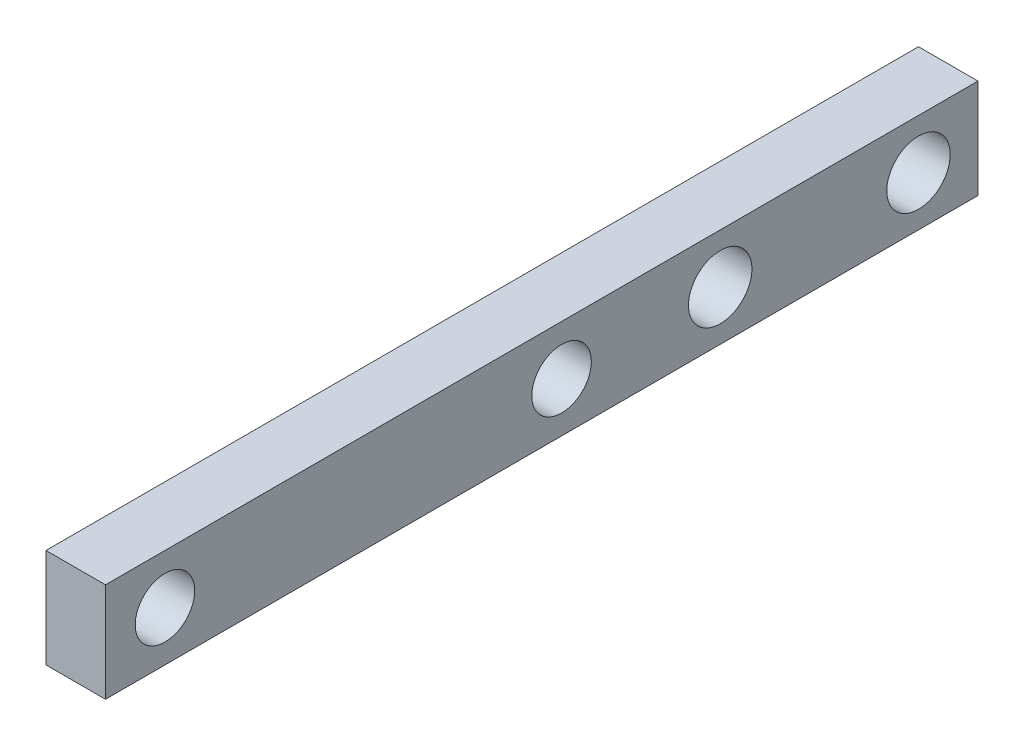
ISO-10303-21;
HEADER;
FILE_DESCRIPTION(('STEP AP214'),'2;1');
FILE_NAME('part.step','',(''),(''),'','','');
FILE_SCHEMA(('AUTOMOTIVE_DESIGN { 1 0 10303 214 1 1 1 1 }'));
ENDSEC;
DATA;
#1=APPLICATION_CONTEXT('core data for automotive mechanical design processes');
#2=APPLICATION_PROTOCOL_DEFINITION('international standard','automotive_design',2000,#1);
#3=PRODUCT_CONTEXT('',#1,'mechanical');
#4=PRODUCT('Part','Part','',(#3));
#5=PRODUCT_RELATED_PRODUCT_CATEGORY('part','',(#4));
#6=PRODUCT_DEFINITION_FORMATION('','',#4);
#7=PRODUCT_DEFINITION_CONTEXT('part definition',#1,'design');
#8=PRODUCT_DEFINITION('design','',#6,#7);
#9=PRODUCT_DEFINITION_SHAPE('','',#8);
#10=(LENGTH_UNIT() NAMED_UNIT(*) SI_UNIT(.MILLI.,.METRE.));
#11=(NAMED_UNIT(*) PLANE_ANGLE_UNIT() SI_UNIT($,.RADIAN.));
#12=(NAMED_UNIT(*) SI_UNIT($,.STERADIAN.) SOLID_ANGLE_UNIT());
#13=UNCERTAINTY_MEASURE_WITH_UNIT(LENGTH_MEASURE(1.E-05),#10,'distance_accuracy_value','');
#14=(GEOMETRIC_REPRESENTATION_CONTEXT(3) GLOBAL_UNCERTAINTY_ASSIGNED_CONTEXT((#13)) GLOBAL_UNIT_ASSIGNED_CONTEXT((#10,
#11,#12)) REPRESENTATION_CONTEXT('',''));
#15=CARTESIAN_POINT('',(0.,0.,0.));
#16=DIRECTION('',(0.,0.,1.));
#17=DIRECTION('',(1.,0.,0.));
#18=AXIS2_PLACEMENT_3D('',#15,#16,#17);
#19=CARTESIAN_POINT('',(3.,0.,0.));
#20=DIRECTION('',(-1.,0.,0.));
#21=DIRECTION('',(0.,0.,1.));
#22=AXIS2_PLACEMENT_3D('',#19,#20,#21);
#23=PLANE('',#22);
#24=DIRECTION('',(0.,1.,0.));
#25=VECTOR('',#24,1.);
#26=CARTESIAN_POINT('',(3.,-2.49999999999999,-22.));
#27=LINE('',#26,#25);
#28=CARTESIAN_POINT('',(3.,-2.49999999999999,-22.));
#29=VERTEX_POINT('',#28);
#30=CARTESIAN_POINT('',(3.,2.49999999999999,-22.));
#31=VERTEX_POINT('',#30);
#32=EDGE_CURVE('E87',#29,#31,#27,.T.);
#33=ORIENTED_EDGE('',*,*,#32,.T.);
#34=DIRECTION('',(0.,0.,1.));
#35=VECTOR('',#34,1.);
#36=CARTESIAN_POINT('',(3.,2.49999999999999,22.));
#37=LINE('',#36,#35);
#38=CARTESIAN_POINT('',(3.,2.49999999999999,22.));
#39=VERTEX_POINT('',#38);
#40=EDGE_CURVE('E82',#31,#39,#37,.T.);
#41=ORIENTED_EDGE('',*,*,#40,.T.);
#42=DIRECTION('',(0.,-1.,0.));
#43=VECTOR('',#42,1.);
#44=CARTESIAN_POINT('',(3.,-2.5,22.));
#45=LINE('',#44,#43);
#46=CARTESIAN_POINT('',(3.,-2.5,22.));
#47=VERTEX_POINT('',#46);
#48=EDGE_CURVE('E85',#39,#47,#45,.T.);
#49=ORIENTED_EDGE('',*,*,#48,.T.);
#50=DIRECTION('',(0.,0.,-1.));
#51=VECTOR('',#50,1.);
#52=CARTESIAN_POINT('',(3.,-2.5,22.));
#53=LINE('',#52,#51);
#54=EDGE_CURVE('E52',#47,#29,#53,.T.);
#55=ORIENTED_EDGE('',*,*,#54,.T.);
#56=EDGE_LOOP('',(#33,#41,#49,#55));
#57=FACE_BOUND('',#56,.T.);
#58=CARTESIAN_POINT('',(3.,0.,-19.));
#59=DIRECTION('',(1.,0.,0.));
#60=DIRECTION('',(0.,0.,-1.));
#61=AXIS2_PLACEMENT_3D('',#58,#59,#60);
#62=CIRCLE('',#61,1.6);
#63=CARTESIAN_POINT('',(3.,0.,-20.6));
#64=VERTEX_POINT('',#63);
#65=EDGE_CURVE('E102',#64,#64,#62,.T.);
#66=ORIENTED_EDGE('',*,*,#65,.F.);
#67=EDGE_LOOP('',(#66));
#68=FACE_BOUND('',#67,.T.);
#69=CARTESIAN_POINT('',(3.,0.,-9.));
#70=DIRECTION('',(1.,0.,0.));
#71=DIRECTION('',(0.,0.,-1.));
#72=AXIS2_PLACEMENT_3D('',#69,#70,#71);
#73=CIRCLE('',#72,1.6);
#74=CARTESIAN_POINT('',(3.,0.,-10.6));
#75=VERTEX_POINT('',#74);
#76=EDGE_CURVE('E117',#75,#75,#73,.T.);
#77=ORIENTED_EDGE('',*,*,#76,.F.);
#78=EDGE_LOOP('',(#77));
#79=FACE_BOUND('',#78,.T.);
#80=CARTESIAN_POINT('',(3.,0.,-0.999999999999999));
#81=DIRECTION('',(1.,0.,0.));
#82=DIRECTION('',(0.,0.,-1.));
#83=AXIS2_PLACEMENT_3D('',#80,#81,#82);
#84=CIRCLE('',#83,1.5);
#85=CARTESIAN_POINT('',(3.,0.,-2.5));
#86=VERTEX_POINT('',#85);
#87=EDGE_CURVE('E123',#86,#86,#84,.T.);
#88=ORIENTED_EDGE('',*,*,#87,.F.);
#89=EDGE_LOOP('',(#88));
#90=FACE_BOUND('',#89,.T.);
#91=CARTESIAN_POINT('',(3.,0.,19.));
#92=DIRECTION('',(1.,0.,0.));
#93=DIRECTION('',(0.,0.,-1.));
#94=AXIS2_PLACEMENT_3D('',#91,#92,#93);
#95=CIRCLE('',#94,1.5);
#96=CARTESIAN_POINT('',(3.,0.,17.5));
#97=VERTEX_POINT('',#96);
#98=EDGE_CURVE('E129',#97,#97,#95,.T.);
#99=ORIENTED_EDGE('',*,*,#98,.F.);
#100=EDGE_LOOP('',(#99));
#101=FACE_BOUND('',#100,.T.);
#102=ADVANCED_FACE('F35',(#57,#68,#79,#90,#101),#23,.F.);
#103=CARTESIAN_POINT('',(0.,0.,0.));
#104=DIRECTION('',(-1.,0.,0.));
#105=DIRECTION('',(0.,0.,1.));
#106=AXIS2_PLACEMENT_3D('',#103,#104,#105);
#107=PLANE('',#106);
#108=CARTESIAN_POINT('',(0.,0.,-0.999999999999999));
#109=DIRECTION('',(1.,0.,0.));
#110=DIRECTION('',(0.,0.,-1.));
#111=AXIS2_PLACEMENT_3D('',#108,#109,#110);
#112=CIRCLE('',#111,1.5);
#113=CARTESIAN_POINT('',(0.,0.,-2.5));
#114=VERTEX_POINT('',#113);
#115=EDGE_CURVE('E126',#114,#114,#112,.T.);
#116=ORIENTED_EDGE('',*,*,#115,.T.);
#117=EDGE_LOOP('',(#116));
#118=FACE_BOUND('',#117,.T.);
#119=CARTESIAN_POINT('',(0.,0.,-19.));
#120=DIRECTION('',(1.,0.,0.));
#121=DIRECTION('',(0.,0.,-1.));
#122=AXIS2_PLACEMENT_3D('',#119,#120,#121);
#123=CIRCLE('',#122,1.6);
#124=CARTESIAN_POINT('',(0.,0.,-20.6));
#125=VERTEX_POINT('',#124);
#126=EDGE_CURVE('E114',#125,#125,#123,.T.);
#127=ORIENTED_EDGE('',*,*,#126,.T.);
#128=EDGE_LOOP('',(#127));
#129=FACE_BOUND('',#128,.T.);
#130=DIRECTION('',(0.,1.,0.));
#131=VECTOR('',#130,1.);
#132=CARTESIAN_POINT('',(0.,-2.49999999999999,-22.));
#133=LINE('',#132,#131);
#134=CARTESIAN_POINT('',(0.,-2.49999999999999,-22.));
#135=VERTEX_POINT('',#134);
#136=CARTESIAN_POINT('',(0.,2.49999999999999,-22.));
#137=VERTEX_POINT('',#136);
#138=EDGE_CURVE('E99',#135,#137,#133,.T.);
#139=ORIENTED_EDGE('',*,*,#138,.F.);
#140=DIRECTION('',(0.,0.,-1.));
#141=VECTOR('',#140,1.);
#142=CARTESIAN_POINT('',(0.,-2.5,22.));
#143=LINE('',#142,#141);
#144=CARTESIAN_POINT('',(0.,-2.5,22.));
#145=VERTEX_POINT('',#144);
#146=EDGE_CURVE('E75',#145,#135,#143,.T.);
#147=ORIENTED_EDGE('',*,*,#146,.F.);
#148=DIRECTION('',(0.,-1.,0.));
#149=VECTOR('',#148,1.);
#150=CARTESIAN_POINT('',(0.,-2.5,22.));
#151=LINE('',#150,#149);
#152=CARTESIAN_POINT('',(0.,2.49999999999999,22.));
#153=VERTEX_POINT('',#152);
#154=EDGE_CURVE('E69',#153,#145,#151,.T.);
#155=ORIENTED_EDGE('',*,*,#154,.F.);
#156=DIRECTION('',(0.,0.,1.));
#157=VECTOR('',#156,1.);
#158=CARTESIAN_POINT('',(0.,2.49999999999999,22.));
#159=LINE('',#158,#157);
#160=EDGE_CURVE('E91',#137,#153,#159,.T.);
#161=ORIENTED_EDGE('',*,*,#160,.F.);
#162=EDGE_LOOP('',(#139,#147,#155,#161));
#163=FACE_BOUND('',#162,.T.);
#164=CARTESIAN_POINT('',(0.,0.,-9.));
#165=DIRECTION('',(1.,0.,0.));
#166=DIRECTION('',(0.,0.,-1.));
#167=AXIS2_PLACEMENT_3D('',#164,#165,#166);
#168=CIRCLE('',#167,1.6);
#169=CARTESIAN_POINT('',(0.,0.,-10.6));
#170=VERTEX_POINT('',#169);
#171=EDGE_CURVE('E120',#170,#170,#168,.T.);
#172=ORIENTED_EDGE('',*,*,#171,.T.);
#173=EDGE_LOOP('',(#172));
#174=FACE_BOUND('',#173,.T.);
#175=CARTESIAN_POINT('',(0.,0.,19.));
#176=DIRECTION('',(1.,0.,0.));
#177=DIRECTION('',(0.,0.,-1.));
#178=AXIS2_PLACEMENT_3D('',#175,#176,#177);
#179=CIRCLE('',#178,1.5);
#180=CARTESIAN_POINT('',(0.,0.,17.5));
#181=VERTEX_POINT('',#180);
#182=EDGE_CURVE('E132',#181,#181,#179,.T.);
#183=ORIENTED_EDGE('',*,*,#182,.T.);
#184=EDGE_LOOP('',(#183));
#185=FACE_BOUND('',#184,.T.);
#186=ADVANCED_FACE('F110',(#118,#129,#163,#174,#185),#107,.T.);
#187=CARTESIAN_POINT('',(3.,-2.49999999999999,-22.));
#188=DIRECTION('',(0.,0.,1.));
#189=DIRECTION('',(1.,0.,0.));
#190=AXIS2_PLACEMENT_3D('',#187,#188,#189);
#191=PLANE('',#190);
#192=ORIENTED_EDGE('',*,*,#138,.T.);
#193=DIRECTION('',(-1.,0.,0.));
#194=VECTOR('',#193,1.);
#195=CARTESIAN_POINT('',(3.,2.49999999999999,-22.));
#196=LINE('',#195,#194);
#197=EDGE_CURVE('E11',#31,#137,#196,.T.);
#198=ORIENTED_EDGE('',*,*,#197,.F.);
#199=ORIENTED_EDGE('',*,*,#32,.F.);
#200=DIRECTION('',(-1.,0.,0.));
#201=VECTOR('',#200,1.);
#202=CARTESIAN_POINT('',(3.,-2.49999999999999,-22.));
#203=LINE('',#202,#201);
#204=EDGE_CURVE('E95',#29,#135,#203,.T.);
#205=ORIENTED_EDGE('',*,*,#204,.T.);
#206=EDGE_LOOP('',(#192,#198,#199,#205));
#207=FACE_BOUND('',#206,.T.);
#208=ADVANCED_FACE('F37',(#207),#191,.F.);
#209=CARTESIAN_POINT('',(3.,2.49999999999999,22.));
#210=DIRECTION('',(0.,-1.,0.));
#211=DIRECTION('',(0.,0.,-1.));
#212=AXIS2_PLACEMENT_3D('',#209,#210,#211);
#213=PLANE('',#212);
#214=ORIENTED_EDGE('',*,*,#160,.T.);
#215=DIRECTION('',(-1.,0.,0.));
#216=VECTOR('',#215,1.);
#217=CARTESIAN_POINT('',(3.,2.49999999999999,22.));
#218=LINE('',#217,#216);
#219=EDGE_CURVE('E44',#39,#153,#218,.T.);
#220=ORIENTED_EDGE('',*,*,#219,.F.);
#221=ORIENTED_EDGE('',*,*,#40,.F.);
#222=ORIENTED_EDGE('',*,*,#197,.T.);
#223=EDGE_LOOP('',(#214,#220,#221,#222));
#224=FACE_BOUND('',#223,.T.);
#225=ADVANCED_FACE('F90',(#224),#213,.F.);
#226=CARTESIAN_POINT('',(3.,-2.5,22.));
#227=DIRECTION('',(0.,0.,-1.));
#228=DIRECTION('',(-1.,0.,0.));
#229=AXIS2_PLACEMENT_3D('',#226,#227,#228);
#230=PLANE('',#229);
#231=ORIENTED_EDGE('',*,*,#154,.T.);
#232=DIRECTION('',(-1.,0.,0.));
#233=VECTOR('',#232,1.);
#234=CARTESIAN_POINT('',(3.,-2.5,22.));
#235=LINE('',#234,#233);
#236=EDGE_CURVE('E92',#47,#145,#235,.T.);
#237=ORIENTED_EDGE('',*,*,#236,.F.);
#238=ORIENTED_EDGE('',*,*,#48,.F.);
#239=ORIENTED_EDGE('',*,*,#219,.T.);
#240=EDGE_LOOP('',(#231,#237,#238,#239));
#241=FACE_BOUND('',#240,.T.);
#242=ADVANCED_FACE('F93',(#241),#230,.F.);
#243=CARTESIAN_POINT('',(3.,-2.5,22.));
#244=DIRECTION('',(0.,1.,0.));
#245=DIRECTION('',(0.,0.,1.));
#246=AXIS2_PLACEMENT_3D('',#243,#244,#245);
#247=PLANE('',#246);
#248=ORIENTED_EDGE('',*,*,#146,.T.);
#249=ORIENTED_EDGE('',*,*,#204,.F.);
#250=ORIENTED_EDGE('',*,*,#54,.F.);
#251=ORIENTED_EDGE('',*,*,#236,.T.);
#252=EDGE_LOOP('',(#248,#249,#250,#251));
#253=FACE_BOUND('',#252,.T.);
#254=ADVANCED_FACE('F107',(#253),#247,.F.);
#255=CARTESIAN_POINT('',(3.,0.,-19.));
#256=DIRECTION('',(-1.,0.,0.));
#257=DIRECTION('',(0.,0.,1.));
#258=AXIS2_PLACEMENT_3D('',#255,#256,#257);
#259=CYLINDRICAL_SURFACE('',#258,1.6);
#260=ORIENTED_EDGE('',*,*,#65,.T.);
#261=EDGE_LOOP('',(#260));
#262=FACE_BOUND('',#261,.T.);
#263=ORIENTED_EDGE('',*,*,#126,.F.);
#264=EDGE_LOOP('',(#263));
#265=FACE_BOUND('',#264,.T.);
#266=ADVANCED_FACE('F149',(#262,#265),#259,.F.);
#267=CARTESIAN_POINT('',(3.,0.,-9.));
#268=DIRECTION('',(-1.,0.,0.));
#269=DIRECTION('',(0.,0.,1.));
#270=AXIS2_PLACEMENT_3D('',#267,#268,#269);
#271=CYLINDRICAL_SURFACE('',#270,1.6);
#272=ORIENTED_EDGE('',*,*,#76,.T.);
#273=EDGE_LOOP('',(#272));
#274=FACE_BOUND('',#273,.T.);
#275=ORIENTED_EDGE('',*,*,#171,.F.);
#276=EDGE_LOOP('',(#275));
#277=FACE_BOUND('',#276,.T.);
#278=ADVANCED_FACE('F195',(#274,#277),#271,.F.);
#279=CARTESIAN_POINT('',(3.,0.,-0.999999999999999));
#280=DIRECTION('',(-1.,0.,0.));
#281=DIRECTION('',(0.,0.,1.));
#282=AXIS2_PLACEMENT_3D('',#279,#280,#281);
#283=CYLINDRICAL_SURFACE('',#282,1.5);
#284=ORIENTED_EDGE('',*,*,#87,.T.);
#285=EDGE_LOOP('',(#284));
#286=FACE_BOUND('',#285,.T.);
#287=ORIENTED_EDGE('',*,*,#115,.F.);
#288=EDGE_LOOP('',(#287));
#289=FACE_BOUND('',#288,.T.);
#290=ADVANCED_FACE('F203',(#286,#289),#283,.F.);
#291=CARTESIAN_POINT('',(3.,0.,19.));
#292=DIRECTION('',(-1.,0.,0.));
#293=DIRECTION('',(0.,0.,1.));
#294=AXIS2_PLACEMENT_3D('',#291,#292,#293);
#295=CYLINDRICAL_SURFACE('',#294,1.5);
#296=ORIENTED_EDGE('',*,*,#98,.T.);
#297=EDGE_LOOP('',(#296));
#298=FACE_BOUND('',#297,.T.);
#299=ORIENTED_EDGE('',*,*,#182,.F.);
#300=EDGE_LOOP('',(#299));
#301=FACE_BOUND('',#300,.T.);
#302=ADVANCED_FACE('F138',(#298,#301),#295,.F.);
#303=CLOSED_SHELL('',(#102,#186,#208,#225,#242,#254,#266,#278,#290,#302));
#304=MANIFOLD_SOLID_BREP('B2',#303);
#305=ADVANCED_BREP_SHAPE_REPRESENTATION('',(#18,#304),#14);
#306=SHAPE_DEFINITION_REPRESENTATION(#9,#305);
ENDSEC;
END-ISO-10303-21;
